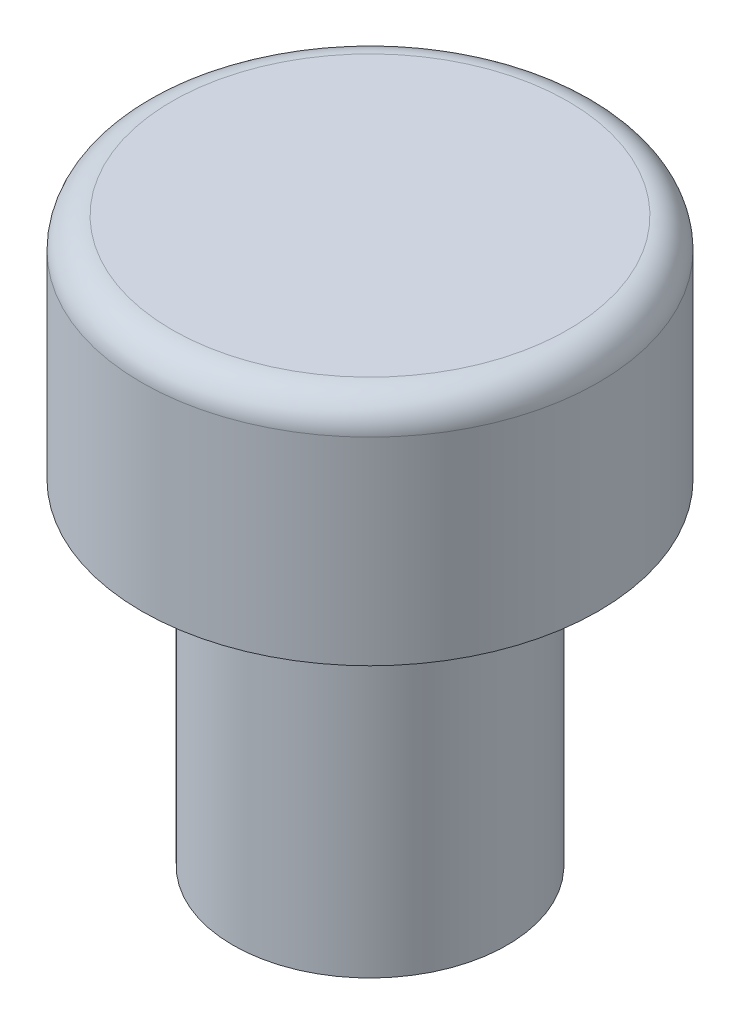
ISO-10303-21;
HEADER;
FILE_DESCRIPTION(('STEP AP214'),'2;1');
FILE_NAME('part.step','',(''),(''),'','','');
FILE_SCHEMA(('AUTOMOTIVE_DESIGN { 1 0 10303 214 1 1 1 1 }'));
ENDSEC;
DATA;
#1=APPLICATION_CONTEXT('core data for automotive mechanical design processes');
#2=APPLICATION_PROTOCOL_DEFINITION('international standard','automotive_design',2000,#1);
#3=PRODUCT_CONTEXT('',#1,'mechanical');
#4=PRODUCT('Part','Part','',(#3));
#5=PRODUCT_RELATED_PRODUCT_CATEGORY('part','',(#4));
#6=PRODUCT_DEFINITION_FORMATION('','',#4);
#7=PRODUCT_DEFINITION_CONTEXT('part definition',#1,'design');
#8=PRODUCT_DEFINITION('design','',#6,#7);
#9=PRODUCT_DEFINITION_SHAPE('','',#8);
#10=(LENGTH_UNIT() NAMED_UNIT(*) SI_UNIT(.MILLI.,.METRE.));
#11=(NAMED_UNIT(*) PLANE_ANGLE_UNIT() SI_UNIT($,.RADIAN.));
#12=(NAMED_UNIT(*) SI_UNIT($,.STERADIAN.) SOLID_ANGLE_UNIT());
#13=UNCERTAINTY_MEASURE_WITH_UNIT(LENGTH_MEASURE(1.E-05),#10,'distance_accuracy_value','');
#14=(GEOMETRIC_REPRESENTATION_CONTEXT(3) GLOBAL_UNCERTAINTY_ASSIGNED_CONTEXT((#13)) GLOBAL_UNIT_ASSIGNED_CONTEXT((#10,
#11,#12)) REPRESENTATION_CONTEXT('',''));
#15=CARTESIAN_POINT('',(0.,0.,0.));
#16=DIRECTION('',(0.,0.,1.));
#17=DIRECTION('',(1.,0.,0.));
#18=AXIS2_PLACEMENT_3D('',#15,#16,#17);
#19=CARTESIAN_POINT('',(0.,7.5,0.));
#20=DIRECTION('',(0.,-1.,0.));
#21=DIRECTION('',(0.,0.,-1.));
#22=AXIS2_PLACEMENT_3D('',#19,#20,#21);
#23=CYLINDRICAL_SURFACE('',#22,7.5);
#24=CARTESIAN_POINT('',(0.,6.5,0.));
#25=DIRECTION('',(0.,1.,0.));
#26=DIRECTION('',(0.,0.,1.));
#27=AXIS2_PLACEMENT_3D('',#24,#25,#26);
#28=CIRCLE('',#27,7.5);
#29=CARTESIAN_POINT('',(0.,6.5,7.5));
#30=VERTEX_POINT('',#29);
#31=EDGE_CURVE('E39',#30,#30,#28,.F.);
#32=ORIENTED_EDGE('',*,*,#31,.T.);
#33=EDGE_LOOP('',(#32));
#34=FACE_BOUND('',#33,.T.);
#35=CARTESIAN_POINT('',(0.,0.,0.));
#36=DIRECTION('',(0.,1.,0.));
#37=DIRECTION('',(0.,0.,1.));
#38=AXIS2_PLACEMENT_3D('',#35,#36,#37);
#39=CIRCLE('',#38,7.5);
#40=CARTESIAN_POINT('',(0.,0.,7.5));
#41=VERTEX_POINT('',#40);
#42=EDGE_CURVE('E83',#41,#41,#39,.T.);
#43=ORIENTED_EDGE('',*,*,#42,.T.);
#44=EDGE_LOOP('',(#43));
#45=FACE_BOUND('',#44,.T.);
#46=ADVANCED_FACE('F35',(#34,#45),#23,.T.);
#47=CARTESIAN_POINT('',(0.,7.5,0.));
#48=DIRECTION('',(0.,1.,0.));
#49=DIRECTION('',(0.,0.,1.));
#50=AXIS2_PLACEMENT_3D('',#47,#48,#49);
#51=PLANE('',#50);
#52=CARTESIAN_POINT('',(0.,7.5,0.));
#53=DIRECTION('',(0.,1.,0.));
#54=DIRECTION('',(0.,0.,1.));
#55=AXIS2_PLACEMENT_3D('',#52,#53,#54);
#56=CIRCLE('',#55,6.5);
#57=CARTESIAN_POINT('',(0.,7.5,6.5));
#58=VERTEX_POINT('',#57);
#59=EDGE_CURVE('E86',#58,#58,#56,.T.);
#60=ORIENTED_EDGE('',*,*,#59,.T.);
#61=EDGE_LOOP('',(#60));
#62=FACE_BOUND('',#61,.T.);
#63=ADVANCED_FACE('F106',(#62),#51,.T.);
#64=CARTESIAN_POINT('',(0.,0.,0.));
#65=DIRECTION('',(0.,1.,0.));
#66=DIRECTION('',(0.,0.,1.));
#67=AXIS2_PLACEMENT_3D('',#64,#65,#66);
#68=PLANE('',#67);
#69=CARTESIAN_POINT('',(0.,0.,0.));
#70=DIRECTION('',(0.,-1.,0.));
#71=DIRECTION('',(0.,0.,-1.));
#72=AXIS2_PLACEMENT_3D('',#69,#70,#71);
#73=CIRCLE('',#72,4.5);
#74=CARTESIAN_POINT('',(0.,0.,-4.5));
#75=VERTEX_POINT('',#74);
#76=EDGE_CURVE('E11',#75,#75,#73,.T.);
#77=ORIENTED_EDGE('',*,*,#76,.F.);
#78=EDGE_LOOP('',(#77));
#79=FACE_BOUND('',#78,.T.);
#80=ORIENTED_EDGE('',*,*,#42,.F.);
#81=EDGE_LOOP('',(#80));
#82=FACE_BOUND('',#81,.T.);
#83=ADVANCED_FACE('F98',(#79,#82),#68,.F.);
#84=CARTESIAN_POINT('',(0.,6.5,0.));
#85=DIRECTION('',(0.,1.,0.));
#86=DIRECTION('',(0.,0.,1.));
#87=AXIS2_PLACEMENT_3D('',#84,#85,#86);
#88=TOROIDAL_SURFACE('',#87,6.5,1.);
#89=ORIENTED_EDGE('',*,*,#31,.F.);
#90=EDGE_LOOP('',(#89));
#91=FACE_BOUND('',#90,.T.);
#92=ORIENTED_EDGE('',*,*,#59,.F.);
#93=EDGE_LOOP('',(#92));
#94=FACE_BOUND('',#93,.T.);
#95=ADVANCED_FACE('F37',(#91,#94),#88,.T.);
#96=CARTESIAN_POINT('',(0.,-11.,0.));
#97=DIRECTION('',(0.,1.,0.));
#98=DIRECTION('',(0.,0.,1.));
#99=AXIS2_PLACEMENT_3D('',#96,#97,#98);
#100=CYLINDRICAL_SURFACE('',#99,4.5);
#101=CARTESIAN_POINT('',(0.,-11.,0.));
#102=DIRECTION('',(0.,-1.,0.));
#103=DIRECTION('',(0.,0.,-1.));
#104=AXIS2_PLACEMENT_3D('',#101,#102,#103);
#105=CIRCLE('',#104,4.5);
#106=CARTESIAN_POINT('',(0.,-11.,-4.5));
#107=VERTEX_POINT('',#106);
#108=EDGE_CURVE('E67',#107,#107,#105,.T.);
#109=ORIENTED_EDGE('',*,*,#108,.F.);
#110=EDGE_LOOP('',(#109));
#111=FACE_BOUND('',#110,.T.);
#112=ORIENTED_EDGE('',*,*,#76,.T.);
#113=EDGE_LOOP('',(#112));
#114=FACE_BOUND('',#113,.T.);
#115=ADVANCED_FACE('F97',(#111,#114),#100,.T.);
#116=CARTESIAN_POINT('',(0.,-11.,0.));
#117=DIRECTION('',(0.,-1.,0.));
#118=DIRECTION('',(0.,0.,-1.));
#119=AXIS2_PLACEMENT_3D('',#116,#117,#118);
#120=PLANE('',#119);
#121=CARTESIAN_POINT('',(0.,-11.,0.));
#122=DIRECTION('',(0.,-1.,0.));
#123=DIRECTION('',(0.,0.,-1.));
#124=AXIS2_PLACEMENT_3D('',#121,#122,#123);
#125=CIRCLE('',#124,3.25);
#126=CARTESIAN_POINT('',(-1.75,-11.,-2.73861278752583));
#127=VERTEX_POINT('',#126);
#128=CARTESIAN_POINT('',(-1.75,-11.,2.73861278752583));
#129=VERTEX_POINT('',#128);
#130=EDGE_CURVE('E55',#127,#129,#125,.T.);
#131=ORIENTED_EDGE('',*,*,#130,.F.);
#132=DIRECTION('',(0.,0.,-1.));
#133=VECTOR('',#132,1.);
#134=CARTESIAN_POINT('',(-1.75,-11.,0.));
#135=LINE('',#134,#133);
#136=EDGE_CURVE('E76',#129,#127,#135,.T.);
#137=ORIENTED_EDGE('',*,*,#136,.F.);
#138=EDGE_LOOP('',(#131,#137));
#139=FACE_BOUND('',#138,.T.);
#140=ORIENTED_EDGE('',*,*,#108,.T.);
#141=EDGE_LOOP('',(#140));
#142=FACE_BOUND('',#141,.T.);
#143=ADVANCED_FACE('F103',(#139,#142),#120,.T.);
#144=CARTESIAN_POINT('',(0.,0.,0.));
#145=DIRECTION('',(0.,-1.,0.));
#146=DIRECTION('',(0.,0.,-1.));
#147=AXIS2_PLACEMENT_3D('',#144,#145,#146);
#148=CYLINDRICAL_SURFACE('',#147,3.25);
#149=ORIENTED_EDGE('',*,*,#130,.T.);
#150=DIRECTION('',(0.,1.,0.));
#151=VECTOR('',#150,1.);
#152=CARTESIAN_POINT('',(-1.75,-11.,2.73861278752583));
#153=LINE('',#152,#151);
#154=CARTESIAN_POINT('',(-1.75,0.,2.73861278752583));
#155=VERTEX_POINT('',#154);
#156=EDGE_CURVE('E69',#129,#155,#153,.T.);
#157=ORIENTED_EDGE('',*,*,#156,.T.);
#158=CARTESIAN_POINT('',(0.,0.,0.));
#159=DIRECTION('',(0.,-1.,0.));
#160=DIRECTION('',(0.,0.,-1.));
#161=AXIS2_PLACEMENT_3D('',#158,#159,#160);
#162=CIRCLE('',#161,3.25);
#163=CARTESIAN_POINT('',(-1.75,0.,-2.73861278752583));
#164=VERTEX_POINT('',#163);
#165=EDGE_CURVE('E63',#164,#155,#162,.T.);
#166=ORIENTED_EDGE('',*,*,#165,.F.);
#167=DIRECTION('',(0.,1.,0.));
#168=VECTOR('',#167,1.);
#169=CARTESIAN_POINT('',(-1.75,-11.,-2.73861278752583));
#170=LINE('',#169,#168);
#171=EDGE_CURVE('E51',#127,#164,#170,.T.);
#172=ORIENTED_EDGE('',*,*,#171,.F.);
#173=EDGE_LOOP('',(#149,#157,#166,#172));
#174=FACE_BOUND('',#173,.T.);
#175=ADVANCED_FACE('F70',(#174),#148,.F.);
#176=CARTESIAN_POINT('',(0.,0.,0.));
#177=DIRECTION('',(0.,-1.,0.));
#178=DIRECTION('',(0.,0.,-1.));
#179=AXIS2_PLACEMENT_3D('',#176,#177,#178);
#180=PLANE('',#179);
#181=DIRECTION('',(0.,0.,-1.));
#182=VECTOR('',#181,1.);
#183=CARTESIAN_POINT('',(-1.75,0.,0.));
#184=LINE('',#183,#182);
#185=EDGE_CURVE('E66',#155,#164,#184,.T.);
#186=ORIENTED_EDGE('',*,*,#185,.T.);
#187=ORIENTED_EDGE('',*,*,#165,.T.);
#188=EDGE_LOOP('',(#186,#187));
#189=FACE_BOUND('',#188,.T.);
#190=ADVANCED_FACE('F64',(#189),#180,.T.);
#191=CARTESIAN_POINT('',(-1.75,-11.,0.));
#192=DIRECTION('',(1.,0.,0.));
#193=DIRECTION('',(0.,0.,-1.));
#194=AXIS2_PLACEMENT_3D('',#191,#192,#193);
#195=PLANE('',#194);
#196=ORIENTED_EDGE('',*,*,#185,.F.);
#197=ORIENTED_EDGE('',*,*,#156,.F.);
#198=ORIENTED_EDGE('',*,*,#136,.T.);
#199=ORIENTED_EDGE('',*,*,#171,.T.);
#200=EDGE_LOOP('',(#196,#197,#198,#199));
#201=FACE_BOUND('',#200,.T.);
#202=ADVANCED_FACE('F75',(#201),#195,.T.);
#203=CLOSED_SHELL('',(#46,#63,#83,#95,#115,#143,#175,#190,#202));
#204=MANIFOLD_SOLID_BREP('B2',#203);
#205=ADVANCED_BREP_SHAPE_REPRESENTATION('',(#18,#204),#14);
#206=SHAPE_DEFINITION_REPRESENTATION(#9,#205);
ENDSEC;
END-ISO-10303-21;
